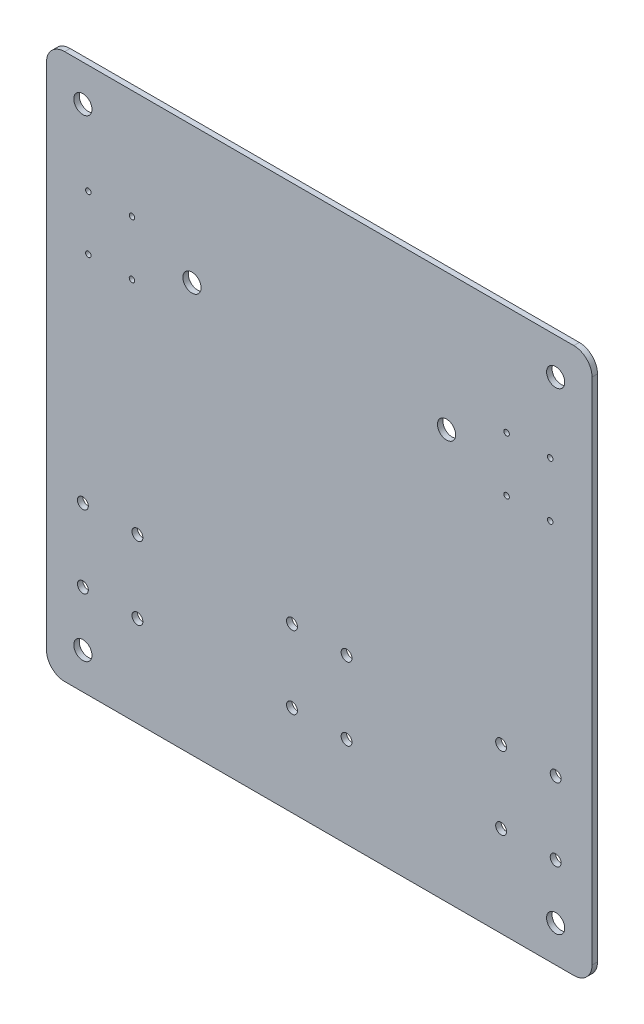
ISO-10303-21;
HEADER;
FILE_DESCRIPTION(('STEP AP214'),'2;1');
FILE_NAME('part.step','',(''),(''),'','','');
FILE_SCHEMA(('AUTOMOTIVE_DESIGN { 1 0 10303 214 1 1 1 1 }'));
ENDSEC;
DATA;
#1=APPLICATION_CONTEXT('core data for automotive mechanical design processes');
#2=APPLICATION_PROTOCOL_DEFINITION('international standard','automotive_design',2000,#1);
#3=PRODUCT_CONTEXT('',#1,'mechanical');
#4=PRODUCT('Part','Part','',(#3));
#5=PRODUCT_RELATED_PRODUCT_CATEGORY('part','',(#4));
#6=PRODUCT_DEFINITION_FORMATION('','',#4);
#7=PRODUCT_DEFINITION_CONTEXT('part definition',#1,'design');
#8=PRODUCT_DEFINITION('design','',#6,#7);
#9=PRODUCT_DEFINITION_SHAPE('','',#8);
#10=(LENGTH_UNIT() NAMED_UNIT(*) SI_UNIT(.MILLI.,.METRE.));
#11=(NAMED_UNIT(*) PLANE_ANGLE_UNIT() SI_UNIT($,.RADIAN.));
#12=(NAMED_UNIT(*) SI_UNIT($,.STERADIAN.) SOLID_ANGLE_UNIT());
#13=UNCERTAINTY_MEASURE_WITH_UNIT(LENGTH_MEASURE(1.E-05),#10,'distance_accuracy_value','');
#14=(GEOMETRIC_REPRESENTATION_CONTEXT(3) GLOBAL_UNCERTAINTY_ASSIGNED_CONTEXT((#13)) GLOBAL_UNIT_ASSIGNED_CONTEXT((#10,
#11,#12)) REPRESENTATION_CONTEXT('',''));
#15=CARTESIAN_POINT('',(0.,0.,0.));
#16=DIRECTION('',(0.,0.,1.));
#17=DIRECTION('',(1.,0.,0.));
#18=AXIS2_PLACEMENT_3D('',#15,#16,#17);
#19=CARTESIAN_POINT('',(-150.,150.,3.));
#20=DIRECTION('',(1.,0.,0.));
#21=DIRECTION('',(0.,0.,-1.));
#22=AXIS2_PLACEMENT_3D('',#19,#20,#21);
#23=PLANE('',#22);
#24=DIRECTION('',(0.,-1.,0.));
#25=VECTOR('',#24,1.);
#26=CARTESIAN_POINT('',(-150.,150.,0.));
#27=LINE('',#26,#25);
#28=CARTESIAN_POINT('',(-150.,140.,0.));
#29=VERTEX_POINT('',#28);
#30=CARTESIAN_POINT('',(-150.,-140.,0.));
#31=VERTEX_POINT('',#30);
#32=EDGE_CURVE('E128',#29,#31,#27,.T.);
#33=ORIENTED_EDGE('',*,*,#32,.T.);
#34=DIRECTION('',(0.,0.,-1.));
#35=VECTOR('',#34,1.);
#36=CARTESIAN_POINT('',(-150.,-140.,3.));
#37=LINE('',#36,#35);
#38=CARTESIAN_POINT('',(-150.,-140.,3.));
#39=VERTEX_POINT('',#38);
#40=EDGE_CURVE('E106',#31,#39,#37,.F.);
#41=ORIENTED_EDGE('',*,*,#40,.T.);
#42=DIRECTION('',(0.,-1.,0.));
#43=VECTOR('',#42,1.);
#44=CARTESIAN_POINT('',(-150.,150.,3.));
#45=LINE('',#44,#43);
#46=CARTESIAN_POINT('',(-150.,140.,3.));
#47=VERTEX_POINT('',#46);
#48=EDGE_CURVE('E138',#47,#39,#45,.T.);
#49=ORIENTED_EDGE('',*,*,#48,.F.);
#50=DIRECTION('',(0.,0.,-1.));
#51=VECTOR('',#50,1.);
#52=CARTESIAN_POINT('',(-150.,140.,3.));
#53=LINE('',#52,#51);
#54=EDGE_CURVE('E111',#47,#29,#53,.T.);
#55=ORIENTED_EDGE('',*,*,#54,.T.);
#56=EDGE_LOOP('',(#33,#41,#49,#55));
#57=FACE_BOUND('',#56,.T.);
#58=ADVANCED_FACE('F35',(#57),#23,.F.);
#59=CARTESIAN_POINT('',(-150.,-150.,3.));
#60=DIRECTION('',(0.,1.,0.));
#61=DIRECTION('',(-1.,0.,0.));
#62=AXIS2_PLACEMENT_3D('',#59,#60,#61);
#63=PLANE('',#62);
#64=DIRECTION('',(1.,0.,0.));
#65=VECTOR('',#64,1.);
#66=CARTESIAN_POINT('',(-150.,-150.,3.));
#67=LINE('',#66,#65);
#68=CARTESIAN_POINT('',(-140.,-150.,3.));
#69=VERTEX_POINT('',#68);
#70=CARTESIAN_POINT('',(140.,-150.,3.));
#71=VERTEX_POINT('',#70);
#72=EDGE_CURVE('E121',#69,#71,#67,.T.);
#73=ORIENTED_EDGE('',*,*,#72,.F.);
#74=DIRECTION('',(0.,0.,-1.));
#75=VECTOR('',#74,1.);
#76=CARTESIAN_POINT('',(-140.,-150.,3.));
#77=LINE('',#76,#75);
#78=CARTESIAN_POINT('',(-140.,-150.,0.));
#79=VERTEX_POINT('',#78);
#80=EDGE_CURVE('E105',#69,#79,#77,.T.);
#81=ORIENTED_EDGE('',*,*,#80,.T.);
#82=DIRECTION('',(1.,0.,0.));
#83=VECTOR('',#82,1.);
#84=CARTESIAN_POINT('',(-150.,-150.,0.));
#85=LINE('',#84,#83);
#86=CARTESIAN_POINT('',(140.,-150.,0.));
#87=VERTEX_POINT('',#86);
#88=EDGE_CURVE('E118',#79,#87,#85,.T.);
#89=ORIENTED_EDGE('',*,*,#88,.T.);
#90=DIRECTION('',(0.,0.,-1.));
#91=VECTOR('',#90,1.);
#92=CARTESIAN_POINT('',(140.,-150.,3.));
#93=LINE('',#92,#91);
#94=EDGE_CURVE('E123',#87,#71,#93,.F.);
#95=ORIENTED_EDGE('',*,*,#94,.T.);
#96=EDGE_LOOP('',(#73,#81,#89,#95));
#97=FACE_BOUND('',#96,.T.);
#98=ADVANCED_FACE('F117',(#97),#63,.F.);
#99=CARTESIAN_POINT('',(150.,150.,3.));
#100=DIRECTION('',(-1.,0.,0.));
#101=DIRECTION('',(0.,-1.,0.));
#102=AXIS2_PLACEMENT_3D('',#99,#100,#101);
#103=PLANE('',#102);
#104=DIRECTION('',(0.,1.,0.));
#105=VECTOR('',#104,1.);
#106=CARTESIAN_POINT('',(150.,150.,3.));
#107=LINE('',#106,#105);
#108=CARTESIAN_POINT('',(150.,-140.,3.));
#109=VERTEX_POINT('',#108);
#110=CARTESIAN_POINT('',(150.,140.,3.));
#111=VERTEX_POINT('',#110);
#112=EDGE_CURVE('E164',#109,#111,#107,.T.);
#113=ORIENTED_EDGE('',*,*,#112,.F.);
#114=DIRECTION('',(0.,0.,-1.));
#115=VECTOR('',#114,1.);
#116=CARTESIAN_POINT('',(150.,-140.,3.));
#117=LINE('',#116,#115);
#118=CARTESIAN_POINT('',(150.,-140.,0.));
#119=VERTEX_POINT('',#118);
#120=EDGE_CURVE('E157',#109,#119,#117,.T.);
#121=ORIENTED_EDGE('',*,*,#120,.T.);
#122=DIRECTION('',(0.,1.,0.));
#123=VECTOR('',#122,1.);
#124=CARTESIAN_POINT('',(150.,150.,0.));
#125=LINE('',#124,#123);
#126=CARTESIAN_POINT('',(150.,140.,0.));
#127=VERTEX_POINT('',#126);
#128=EDGE_CURVE('E127',#119,#127,#125,.T.);
#129=ORIENTED_EDGE('',*,*,#128,.T.);
#130=DIRECTION('',(0.,0.,-1.));
#131=VECTOR('',#130,1.);
#132=CARTESIAN_POINT('',(150.,140.,3.));
#133=LINE('',#132,#131);
#134=EDGE_CURVE('E155',#127,#111,#133,.F.);
#135=ORIENTED_EDGE('',*,*,#134,.T.);
#136=EDGE_LOOP('',(#113,#121,#129,#135));
#137=FACE_BOUND('',#136,.T.);
#138=ADVANCED_FACE('F162',(#137),#103,.F.);
#139=CARTESIAN_POINT('',(-150.,150.,3.));
#140=DIRECTION('',(0.,-1.,0.));
#141=DIRECTION('',(0.,0.,-1.));
#142=AXIS2_PLACEMENT_3D('',#139,#140,#141);
#143=PLANE('',#142);
#144=DIRECTION('',(-1.,0.,0.));
#145=VECTOR('',#144,1.);
#146=CARTESIAN_POINT('',(-150.,150.,3.));
#147=LINE('',#146,#145);
#148=CARTESIAN_POINT('',(140.,150.,3.));
#149=VERTEX_POINT('',#148);
#150=CARTESIAN_POINT('',(-140.,150.,3.));
#151=VERTEX_POINT('',#150);
#152=EDGE_CURVE('E139',#149,#151,#147,.T.);
#153=ORIENTED_EDGE('',*,*,#152,.F.);
#154=DIRECTION('',(0.,0.,-1.));
#155=VECTOR('',#154,1.);
#156=CARTESIAN_POINT('',(140.,150.,3.));
#157=LINE('',#156,#155);
#158=CARTESIAN_POINT('',(140.,150.,0.));
#159=VERTEX_POINT('',#158);
#160=EDGE_CURVE('E11',#149,#159,#157,.T.);
#161=ORIENTED_EDGE('',*,*,#160,.T.);
#162=DIRECTION('',(-1.,0.,0.));
#163=VECTOR('',#162,1.);
#164=CARTESIAN_POINT('',(-150.,150.,0.));
#165=LINE('',#164,#163);
#166=CARTESIAN_POINT('',(-140.,150.,0.));
#167=VERTEX_POINT('',#166);
#168=EDGE_CURVE('E131',#159,#167,#165,.T.);
#169=ORIENTED_EDGE('',*,*,#168,.T.);
#170=DIRECTION('',(0.,0.,-1.));
#171=VECTOR('',#170,1.);
#172=CARTESIAN_POINT('',(-140.,150.,3.));
#173=LINE('',#172,#171);
#174=EDGE_CURVE('E43',#167,#151,#173,.F.);
#175=ORIENTED_EDGE('',*,*,#174,.T.);
#176=EDGE_LOOP('',(#153,#161,#169,#175));
#177=FACE_BOUND('',#176,.T.);
#178=ADVANCED_FACE('F171',(#177),#143,.F.);
#179=CARTESIAN_POINT('',(0.,0.,3.));
#180=DIRECTION('',(0.,0.,1.));
#181=DIRECTION('',(1.,0.,0.));
#182=AXIS2_PLACEMENT_3D('',#179,#180,#181);
#183=PLANE('',#182);
#184=CARTESIAN_POINT('',(15.,-100.,3.));
#185=DIRECTION('',(0.,0.,1.));
#186=DIRECTION('',(1.,0.,0.));
#187=AXIS2_PLACEMENT_3D('',#184,#185,#186);
#188=CIRCLE('',#187,3.);
#189=CARTESIAN_POINT('',(18.,-100.,3.));
#190=VERTEX_POINT('',#189);
#191=EDGE_CURVE('E328',#190,#190,#188,.T.);
#192=ORIENTED_EDGE('',*,*,#191,.F.);
#193=EDGE_LOOP('',(#192));
#194=FACE_BOUND('',#193,.T.);
#195=CARTESIAN_POINT('',(-15.,-100.,3.));
#196=DIRECTION('',(0.,0.,1.));
#197=DIRECTION('',(1.,0.,0.));
#198=AXIS2_PLACEMENT_3D('',#195,#196,#197);
#199=CIRCLE('',#198,3.);
#200=CARTESIAN_POINT('',(-12.,-100.,3.));
#201=VERTEX_POINT('',#200);
#202=EDGE_CURVE('E322',#201,#201,#199,.T.);
#203=ORIENTED_EDGE('',*,*,#202,.F.);
#204=EDGE_LOOP('',(#203));
#205=FACE_BOUND('',#204,.T.);
#206=CARTESIAN_POINT('',(15.,-60.,3.));
#207=DIRECTION('',(0.,0.,1.));
#208=DIRECTION('',(1.,0.,0.));
#209=AXIS2_PLACEMENT_3D('',#206,#207,#208);
#210=CIRCLE('',#209,3.);
#211=CARTESIAN_POINT('',(18.,-60.,3.));
#212=VERTEX_POINT('',#211);
#213=EDGE_CURVE('E316',#212,#212,#210,.T.);
#214=ORIENTED_EDGE('',*,*,#213,.F.);
#215=EDGE_LOOP('',(#214));
#216=FACE_BOUND('',#215,.T.);
#217=CARTESIAN_POINT('',(-15.,-60.,3.));
#218=DIRECTION('',(0.,0.,1.));
#219=DIRECTION('',(1.,0.,0.));
#220=AXIS2_PLACEMENT_3D('',#217,#218,#219);
#221=CIRCLE('',#220,3.);
#222=CARTESIAN_POINT('',(-12.,-60.,3.));
#223=VERTEX_POINT('',#222);
#224=EDGE_CURVE('E310',#223,#223,#221,.T.);
#225=ORIENTED_EDGE('',*,*,#224,.F.);
#226=EDGE_LOOP('',(#225));
#227=FACE_BOUND('',#226,.T.);
#228=CARTESIAN_POINT('',(100.,-100.,3.));
#229=DIRECTION('',(0.,0.,-1.));
#230=DIRECTION('',(-1.,0.,0.));
#231=AXIS2_PLACEMENT_3D('',#228,#229,#230);
#232=CIRCLE('',#231,3.00000000000001);
#233=CARTESIAN_POINT('',(97.,-100.,3.));
#234=VERTEX_POINT('',#233);
#235=EDGE_CURVE('E304',#234,#234,#232,.T.);
#236=ORIENTED_EDGE('',*,*,#235,.T.);
#237=EDGE_LOOP('',(#236));
#238=FACE_BOUND('',#237,.T.);
#239=CARTESIAN_POINT('',(100.,-60.,3.));
#240=DIRECTION('',(0.,0.,-1.));
#241=DIRECTION('',(-1.,0.,0.));
#242=AXIS2_PLACEMENT_3D('',#239,#240,#241);
#243=CIRCLE('',#242,3.00000000000001);
#244=CARTESIAN_POINT('',(97.,-60.,3.));
#245=VERTEX_POINT('',#244);
#246=EDGE_CURVE('E298',#245,#245,#243,.T.);
#247=ORIENTED_EDGE('',*,*,#246,.T.);
#248=EDGE_LOOP('',(#247));
#249=FACE_BOUND('',#248,.T.);
#250=CARTESIAN_POINT('',(130.,-60.,3.));
#251=DIRECTION('',(0.,0.,-1.));
#252=DIRECTION('',(-1.,0.,0.));
#253=AXIS2_PLACEMENT_3D('',#250,#251,#252);
#254=CIRCLE('',#253,2.99999999999999);
#255=CARTESIAN_POINT('',(127.,-60.,3.));
#256=VERTEX_POINT('',#255);
#257=EDGE_CURVE('E292',#256,#256,#254,.T.);
#258=ORIENTED_EDGE('',*,*,#257,.T.);
#259=EDGE_LOOP('',(#258));
#260=FACE_BOUND('',#259,.T.);
#261=CARTESIAN_POINT('',(130.,-100.,3.));
#262=DIRECTION('',(0.,0.,-1.));
#263=DIRECTION('',(-1.,0.,0.));
#264=AXIS2_PLACEMENT_3D('',#261,#262,#263);
#265=CIRCLE('',#264,2.99999999999999);
#266=CARTESIAN_POINT('',(127.,-100.,3.));
#267=VERTEX_POINT('',#266);
#268=EDGE_CURVE('E286',#267,#267,#265,.T.);
#269=ORIENTED_EDGE('',*,*,#268,.T.);
#270=EDGE_LOOP('',(#269));
#271=FACE_BOUND('',#270,.T.);
#272=CARTESIAN_POINT('',(-100.,-100.,3.));
#273=DIRECTION('',(0.,0.,1.));
#274=DIRECTION('',(1.,0.,0.));
#275=AXIS2_PLACEMENT_3D('',#272,#273,#274);
#276=CIRCLE('',#275,3.00000000000001);
#277=CARTESIAN_POINT('',(-97.,-100.,3.));
#278=VERTEX_POINT('',#277);
#279=EDGE_CURVE('E280',#278,#278,#276,.T.);
#280=ORIENTED_EDGE('',*,*,#279,.F.);
#281=EDGE_LOOP('',(#280));
#282=FACE_BOUND('',#281,.T.);
#283=CARTESIAN_POINT('',(-100.,-60.,3.));
#284=DIRECTION('',(0.,0.,1.));
#285=DIRECTION('',(1.,0.,0.));
#286=AXIS2_PLACEMENT_3D('',#283,#284,#285);
#287=CIRCLE('',#286,3.00000000000001);
#288=CARTESIAN_POINT('',(-97.,-60.,3.));
#289=VERTEX_POINT('',#288);
#290=EDGE_CURVE('E274',#289,#289,#287,.T.);
#291=ORIENTED_EDGE('',*,*,#290,.F.);
#292=EDGE_LOOP('',(#291));
#293=FACE_BOUND('',#292,.T.);
#294=CARTESIAN_POINT('',(-130.,-60.,3.));
#295=DIRECTION('',(0.,0.,1.));
#296=DIRECTION('',(1.,0.,0.));
#297=AXIS2_PLACEMENT_3D('',#294,#295,#296);
#298=CIRCLE('',#297,2.99999999999999);
#299=CARTESIAN_POINT('',(-127.,-60.,3.));
#300=VERTEX_POINT('',#299);
#301=EDGE_CURVE('E268',#300,#300,#298,.T.);
#302=ORIENTED_EDGE('',*,*,#301,.F.);
#303=EDGE_LOOP('',(#302));
#304=FACE_BOUND('',#303,.T.);
#305=CARTESIAN_POINT('',(-130.,-100.,3.));
#306=DIRECTION('',(0.,0.,1.));
#307=DIRECTION('',(1.,0.,0.));
#308=AXIS2_PLACEMENT_3D('',#305,#306,#307);
#309=CIRCLE('',#308,2.99999999999999);
#310=CARTESIAN_POINT('',(-127.,-100.,3.));
#311=VERTEX_POINT('',#310);
#312=EDGE_CURVE('E262',#311,#311,#309,.T.);
#313=ORIENTED_EDGE('',*,*,#312,.F.);
#314=EDGE_LOOP('',(#313));
#315=FACE_BOUND('',#314,.T.);
#316=CARTESIAN_POINT('',(70.,75.,3.));
#317=DIRECTION('',(0.,0.,1.));
#318=DIRECTION('',(1.,0.,0.));
#319=AXIS2_PLACEMENT_3D('',#316,#317,#318);
#320=CIRCLE('',#319,5.00000000000001);
#321=CARTESIAN_POINT('',(75.0000000000001,75.,3.));
#322=VERTEX_POINT('',#321);
#323=EDGE_CURVE('E256',#322,#322,#320,.T.);
#324=ORIENTED_EDGE('',*,*,#323,.F.);
#325=EDGE_LOOP('',(#324));
#326=FACE_BOUND('',#325,.T.);
#327=CARTESIAN_POINT('',(-70.,75.,3.));
#328=DIRECTION('',(0.,0.,1.));
#329=DIRECTION('',(1.,0.,0.));
#330=AXIS2_PLACEMENT_3D('',#327,#328,#329);
#331=CIRCLE('',#330,5.00000000000001);
#332=CARTESIAN_POINT('',(-65.,75.,3.));
#333=VERTEX_POINT('',#332);
#334=EDGE_CURVE('E250',#333,#333,#331,.T.);
#335=ORIENTED_EDGE('',*,*,#334,.F.);
#336=EDGE_LOOP('',(#335));
#337=FACE_BOUND('',#336,.T.);
#338=CARTESIAN_POINT('',(130.,-130.,3.));
#339=DIRECTION('',(0.,0.,1.));
#340=DIRECTION('',(-1.,0.,0.));
#341=AXIS2_PLACEMENT_3D('',#338,#339,#340);
#342=CIRCLE('',#341,5.00000000000002);
#343=CARTESIAN_POINT('',(125.,-130.,3.));
#344=VERTEX_POINT('',#343);
#345=EDGE_CURVE('E244',#344,#344,#342,.T.);
#346=ORIENTED_EDGE('',*,*,#345,.F.);
#347=EDGE_LOOP('',(#346));
#348=FACE_BOUND('',#347,.T.);
#349=CARTESIAN_POINT('',(-130.,-130.,3.));
#350=DIRECTION('',(0.,0.,-1.));
#351=DIRECTION('',(1.,0.,0.));
#352=AXIS2_PLACEMENT_3D('',#349,#350,#351);
#353=CIRCLE('',#352,5.00000000000002);
#354=CARTESIAN_POINT('',(-125.,-130.,3.));
#355=VERTEX_POINT('',#354);
#356=EDGE_CURVE('E238',#355,#355,#353,.T.);
#357=ORIENTED_EDGE('',*,*,#356,.T.);
#358=EDGE_LOOP('',(#357));
#359=FACE_BOUND('',#358,.T.);
#360=CARTESIAN_POINT('',(130.,130.,3.));
#361=DIRECTION('',(0.,0.,-1.));
#362=DIRECTION('',(-1.,0.,0.));
#363=AXIS2_PLACEMENT_3D('',#360,#361,#362);
#364=CIRCLE('',#363,5.00000000000002);
#365=CARTESIAN_POINT('',(125.,130.,3.));
#366=VERTEX_POINT('',#365);
#367=EDGE_CURVE('E232',#366,#366,#364,.T.);
#368=ORIENTED_EDGE('',*,*,#367,.T.);
#369=EDGE_LOOP('',(#368));
#370=FACE_BOUND('',#369,.T.);
#371=CARTESIAN_POINT('',(-130.,130.,3.));
#372=DIRECTION('',(0.,0.,1.));
#373=DIRECTION('',(1.,0.,0.));
#374=AXIS2_PLACEMENT_3D('',#371,#372,#373);
#375=CIRCLE('',#374,5.00000000000002);
#376=CARTESIAN_POINT('',(-125.,130.,3.));
#377=VERTEX_POINT('',#376);
#378=EDGE_CURVE('E226',#377,#377,#375,.T.);
#379=ORIENTED_EDGE('',*,*,#378,.F.);
#380=EDGE_LOOP('',(#379));
#381=FACE_BOUND('',#380,.T.);
#382=CARTESIAN_POINT('',(-127.,60.,3.));
#383=DIRECTION('',(0.,0.,-1.));
#384=DIRECTION('',(-1.,0.,0.));
#385=AXIS2_PLACEMENT_3D('',#382,#383,#384);
#386=CIRCLE('',#385,1.5);
#387=CARTESIAN_POINT('',(-128.5,60.,3.));
#388=VERTEX_POINT('',#387);
#389=EDGE_CURVE('E220',#388,#388,#386,.T.);
#390=ORIENTED_EDGE('',*,*,#389,.T.);
#391=EDGE_LOOP('',(#390));
#392=FACE_BOUND('',#391,.T.);
#393=CARTESIAN_POINT('',(-103.,60.,3.));
#394=DIRECTION('',(0.,0.,-1.));
#395=DIRECTION('',(-1.,0.,0.));
#396=AXIS2_PLACEMENT_3D('',#393,#394,#395);
#397=CIRCLE('',#396,1.5);
#398=CARTESIAN_POINT('',(-104.5,60.,3.));
#399=VERTEX_POINT('',#398);
#400=EDGE_CURVE('E214',#399,#399,#397,.T.);
#401=ORIENTED_EDGE('',*,*,#400,.T.);
#402=EDGE_LOOP('',(#401));
#403=FACE_BOUND('',#402,.T.);
#404=CARTESIAN_POINT('',(-127.,90.,3.));
#405=DIRECTION('',(0.,0.,-1.));
#406=DIRECTION('',(-1.,0.,0.));
#407=AXIS2_PLACEMENT_3D('',#404,#405,#406);
#408=CIRCLE('',#407,1.5);
#409=CARTESIAN_POINT('',(-128.5,90.,3.));
#410=VERTEX_POINT('',#409);
#411=EDGE_CURVE('E208',#410,#410,#408,.T.);
#412=ORIENTED_EDGE('',*,*,#411,.T.);
#413=EDGE_LOOP('',(#412));
#414=FACE_BOUND('',#413,.T.);
#415=CARTESIAN_POINT('',(-103.,90.,3.));
#416=DIRECTION('',(0.,0.,-1.));
#417=DIRECTION('',(-1.,0.,0.));
#418=AXIS2_PLACEMENT_3D('',#415,#416,#417);
#419=CIRCLE('',#418,1.5);
#420=CARTESIAN_POINT('',(-104.5,90.,3.));
#421=VERTEX_POINT('',#420);
#422=EDGE_CURVE('E202',#421,#421,#419,.T.);
#423=ORIENTED_EDGE('',*,*,#422,.T.);
#424=EDGE_LOOP('',(#423));
#425=FACE_BOUND('',#424,.T.);
#426=CARTESIAN_POINT('',(127.,60.,3.));
#427=DIRECTION('',(0.,0.,1.));
#428=DIRECTION('',(1.,0.,0.));
#429=AXIS2_PLACEMENT_3D('',#426,#427,#428);
#430=CIRCLE('',#429,1.5);
#431=CARTESIAN_POINT('',(128.5,60.,3.));
#432=VERTEX_POINT('',#431);
#433=EDGE_CURVE('E196',#432,#432,#430,.T.);
#434=ORIENTED_EDGE('',*,*,#433,.F.);
#435=EDGE_LOOP('',(#434));
#436=FACE_BOUND('',#435,.T.);
#437=CARTESIAN_POINT('',(103.,60.,3.));
#438=DIRECTION('',(0.,0.,1.));
#439=DIRECTION('',(1.,0.,0.));
#440=AXIS2_PLACEMENT_3D('',#437,#438,#439);
#441=CIRCLE('',#440,1.5);
#442=CARTESIAN_POINT('',(104.5,60.,3.));
#443=VERTEX_POINT('',#442);
#444=EDGE_CURVE('E190',#443,#443,#441,.T.);
#445=ORIENTED_EDGE('',*,*,#444,.F.);
#446=EDGE_LOOP('',(#445));
#447=FACE_BOUND('',#446,.T.);
#448=CARTESIAN_POINT('',(127.,90.,3.));
#449=DIRECTION('',(0.,0.,1.));
#450=DIRECTION('',(1.,0.,0.));
#451=AXIS2_PLACEMENT_3D('',#448,#449,#450);
#452=CIRCLE('',#451,1.5);
#453=CARTESIAN_POINT('',(128.5,90.,3.));
#454=VERTEX_POINT('',#453);
#455=EDGE_CURVE('E184',#454,#454,#452,.T.);
#456=ORIENTED_EDGE('',*,*,#455,.F.);
#457=EDGE_LOOP('',(#456));
#458=FACE_BOUND('',#457,.T.);
#459=CARTESIAN_POINT('',(103.,90.,3.));
#460=DIRECTION('',(0.,0.,1.));
#461=DIRECTION('',(1.,0.,0.));
#462=AXIS2_PLACEMENT_3D('',#459,#460,#461);
#463=CIRCLE('',#462,1.5);
#464=CARTESIAN_POINT('',(104.5,90.,3.));
#465=VERTEX_POINT('',#464);
#466=EDGE_CURVE('E178',#465,#465,#463,.T.);
#467=ORIENTED_EDGE('',*,*,#466,.F.);
#468=EDGE_LOOP('',(#467));
#469=FACE_BOUND('',#468,.T.);
#470=ORIENTED_EDGE('',*,*,#48,.T.);
#471=CARTESIAN_POINT('',(-140.,-140.,3.));
#472=DIRECTION('',(0.,0.,1.));
#473=DIRECTION('',(1.,0.,0.));
#474=AXIS2_PLACEMENT_3D('',#471,#472,#473);
#475=CIRCLE('',#474,10.);
#476=EDGE_CURVE('E153',#39,#69,#475,.T.);
#477=ORIENTED_EDGE('',*,*,#476,.T.);
#478=ORIENTED_EDGE('',*,*,#72,.T.);
#479=CARTESIAN_POINT('',(140.,-140.,3.));
#480=DIRECTION('',(0.,0.,1.));
#481=DIRECTION('',(1.,0.,0.));
#482=AXIS2_PLACEMENT_3D('',#479,#480,#481);
#483=CIRCLE('',#482,10.);
#484=EDGE_CURVE('E151',#71,#109,#483,.T.);
#485=ORIENTED_EDGE('',*,*,#484,.T.);
#486=ORIENTED_EDGE('',*,*,#112,.T.);
#487=CARTESIAN_POINT('',(140.,140.,3.));
#488=DIRECTION('',(0.,0.,1.));
#489=DIRECTION('',(1.,0.,0.));
#490=AXIS2_PLACEMENT_3D('',#487,#488,#489);
#491=CIRCLE('',#490,10.);
#492=EDGE_CURVE('E56',#111,#149,#491,.T.);
#493=ORIENTED_EDGE('',*,*,#492,.T.);
#494=ORIENTED_EDGE('',*,*,#152,.T.);
#495=CARTESIAN_POINT('',(-140.,140.,3.));
#496=DIRECTION('',(0.,0.,1.));
#497=DIRECTION('',(1.,0.,0.));
#498=AXIS2_PLACEMENT_3D('',#495,#496,#497);
#499=CIRCLE('',#498,10.);
#500=EDGE_CURVE('E148',#151,#47,#499,.T.);
#501=ORIENTED_EDGE('',*,*,#500,.T.);
#502=EDGE_LOOP('',(#470,#477,#478,#485,#486,#493,#494,#501));
#503=FACE_BOUND('',#502,.T.);
#504=ADVANCED_FACE('F343',(#194,#205,#216,#227,#238,#249,#260,#271,#282,#293,#304,#315,#326,
#337,#348,#359,#370,#381,#392,#403,#414,#425,#436,#447,#458,#469,#503),#183,.T.);
#505=CARTESIAN_POINT('',(0.,0.,0.));
#506=DIRECTION('',(0.,0.,1.));
#507=DIRECTION('',(1.,0.,0.));
#508=AXIS2_PLACEMENT_3D('',#505,#506,#507);
#509=PLANE('',#508);
#510=CARTESIAN_POINT('',(15.,-100.,0.));
#511=DIRECTION('',(0.,0.,1.));
#512=DIRECTION('',(1.,0.,0.));
#513=AXIS2_PLACEMENT_3D('',#510,#511,#512);
#514=CIRCLE('',#513,3.);
#515=CARTESIAN_POINT('',(18.,-100.,0.));
#516=VERTEX_POINT('',#515);
#517=EDGE_CURVE('E325',#516,#516,#514,.T.);
#518=ORIENTED_EDGE('',*,*,#517,.T.);
#519=EDGE_LOOP('',(#518));
#520=FACE_BOUND('',#519,.T.);
#521=CARTESIAN_POINT('',(-15.,-100.,0.));
#522=DIRECTION('',(0.,0.,1.));
#523=DIRECTION('',(1.,0.,0.));
#524=AXIS2_PLACEMENT_3D('',#521,#522,#523);
#525=CIRCLE('',#524,3.);
#526=CARTESIAN_POINT('',(-12.,-100.,0.));
#527=VERTEX_POINT('',#526);
#528=EDGE_CURVE('E319',#527,#527,#525,.T.);
#529=ORIENTED_EDGE('',*,*,#528,.T.);
#530=EDGE_LOOP('',(#529));
#531=FACE_BOUND('',#530,.T.);
#532=CARTESIAN_POINT('',(15.,-60.,0.));
#533=DIRECTION('',(0.,0.,1.));
#534=DIRECTION('',(1.,0.,0.));
#535=AXIS2_PLACEMENT_3D('',#532,#533,#534);
#536=CIRCLE('',#535,3.);
#537=CARTESIAN_POINT('',(18.,-60.,0.));
#538=VERTEX_POINT('',#537);
#539=EDGE_CURVE('E313',#538,#538,#536,.T.);
#540=ORIENTED_EDGE('',*,*,#539,.T.);
#541=EDGE_LOOP('',(#540));
#542=FACE_BOUND('',#541,.T.);
#543=CARTESIAN_POINT('',(-15.,-60.,0.));
#544=DIRECTION('',(0.,0.,1.));
#545=DIRECTION('',(1.,0.,0.));
#546=AXIS2_PLACEMENT_3D('',#543,#544,#545);
#547=CIRCLE('',#546,3.);
#548=CARTESIAN_POINT('',(-12.,-60.,0.));
#549=VERTEX_POINT('',#548);
#550=EDGE_CURVE('E307',#549,#549,#547,.T.);
#551=ORIENTED_EDGE('',*,*,#550,.T.);
#552=EDGE_LOOP('',(#551));
#553=FACE_BOUND('',#552,.T.);
#554=CARTESIAN_POINT('',(100.,-100.,0.));
#555=DIRECTION('',(0.,0.,-1.));
#556=DIRECTION('',(-1.,0.,0.));
#557=AXIS2_PLACEMENT_3D('',#554,#555,#556);
#558=CIRCLE('',#557,3.00000000000001);
#559=CARTESIAN_POINT('',(97.,-100.,0.));
#560=VERTEX_POINT('',#559);
#561=EDGE_CURVE('E301',#560,#560,#558,.T.);
#562=ORIENTED_EDGE('',*,*,#561,.F.);
#563=EDGE_LOOP('',(#562));
#564=FACE_BOUND('',#563,.T.);
#565=CARTESIAN_POINT('',(100.,-60.,0.));
#566=DIRECTION('',(0.,0.,-1.));
#567=DIRECTION('',(-1.,0.,0.));
#568=AXIS2_PLACEMENT_3D('',#565,#566,#567);
#569=CIRCLE('',#568,3.00000000000001);
#570=CARTESIAN_POINT('',(97.,-60.,0.));
#571=VERTEX_POINT('',#570);
#572=EDGE_CURVE('E295',#571,#571,#569,.T.);
#573=ORIENTED_EDGE('',*,*,#572,.F.);
#574=EDGE_LOOP('',(#573));
#575=FACE_BOUND('',#574,.T.);
#576=CARTESIAN_POINT('',(130.,-60.,0.));
#577=DIRECTION('',(0.,0.,-1.));
#578=DIRECTION('',(-1.,0.,0.));
#579=AXIS2_PLACEMENT_3D('',#576,#577,#578);
#580=CIRCLE('',#579,2.99999999999999);
#581=CARTESIAN_POINT('',(127.,-60.,0.));
#582=VERTEX_POINT('',#581);
#583=EDGE_CURVE('E289',#582,#582,#580,.T.);
#584=ORIENTED_EDGE('',*,*,#583,.F.);
#585=EDGE_LOOP('',(#584));
#586=FACE_BOUND('',#585,.T.);
#587=CARTESIAN_POINT('',(130.,-100.,0.));
#588=DIRECTION('',(0.,0.,-1.));
#589=DIRECTION('',(-1.,0.,0.));
#590=AXIS2_PLACEMENT_3D('',#587,#588,#589);
#591=CIRCLE('',#590,2.99999999999999);
#592=CARTESIAN_POINT('',(127.,-100.,0.));
#593=VERTEX_POINT('',#592);
#594=EDGE_CURVE('E283',#593,#593,#591,.T.);
#595=ORIENTED_EDGE('',*,*,#594,.F.);
#596=EDGE_LOOP('',(#595));
#597=FACE_BOUND('',#596,.T.);
#598=CARTESIAN_POINT('',(-100.,-100.,0.));
#599=DIRECTION('',(0.,0.,1.));
#600=DIRECTION('',(1.,0.,0.));
#601=AXIS2_PLACEMENT_3D('',#598,#599,#600);
#602=CIRCLE('',#601,3.00000000000001);
#603=CARTESIAN_POINT('',(-97.,-100.,0.));
#604=VERTEX_POINT('',#603);
#605=EDGE_CURVE('E277',#604,#604,#602,.T.);
#606=ORIENTED_EDGE('',*,*,#605,.T.);
#607=EDGE_LOOP('',(#606));
#608=FACE_BOUND('',#607,.T.);
#609=CARTESIAN_POINT('',(-100.,-60.,0.));
#610=DIRECTION('',(0.,0.,1.));
#611=DIRECTION('',(1.,0.,0.));
#612=AXIS2_PLACEMENT_3D('',#609,#610,#611);
#613=CIRCLE('',#612,3.00000000000001);
#614=CARTESIAN_POINT('',(-97.,-60.,0.));
#615=VERTEX_POINT('',#614);
#616=EDGE_CURVE('E271',#615,#615,#613,.T.);
#617=ORIENTED_EDGE('',*,*,#616,.T.);
#618=EDGE_LOOP('',(#617));
#619=FACE_BOUND('',#618,.T.);
#620=CARTESIAN_POINT('',(-130.,-60.,0.));
#621=DIRECTION('',(0.,0.,1.));
#622=DIRECTION('',(1.,0.,0.));
#623=AXIS2_PLACEMENT_3D('',#620,#621,#622);
#624=CIRCLE('',#623,2.99999999999999);
#625=CARTESIAN_POINT('',(-127.,-60.,0.));
#626=VERTEX_POINT('',#625);
#627=EDGE_CURVE('E265',#626,#626,#624,.T.);
#628=ORIENTED_EDGE('',*,*,#627,.T.);
#629=EDGE_LOOP('',(#628));
#630=FACE_BOUND('',#629,.T.);
#631=CARTESIAN_POINT('',(-130.,-100.,0.));
#632=DIRECTION('',(0.,0.,1.));
#633=DIRECTION('',(1.,0.,0.));
#634=AXIS2_PLACEMENT_3D('',#631,#632,#633);
#635=CIRCLE('',#634,2.99999999999999);
#636=CARTESIAN_POINT('',(-127.,-100.,0.));
#637=VERTEX_POINT('',#636);
#638=EDGE_CURVE('E259',#637,#637,#635,.T.);
#639=ORIENTED_EDGE('',*,*,#638,.T.);
#640=EDGE_LOOP('',(#639));
#641=FACE_BOUND('',#640,.T.);
#642=CARTESIAN_POINT('',(70.,75.,0.));
#643=DIRECTION('',(0.,0.,1.));
#644=DIRECTION('',(1.,0.,0.));
#645=AXIS2_PLACEMENT_3D('',#642,#643,#644);
#646=CIRCLE('',#645,5.00000000000001);
#647=CARTESIAN_POINT('',(75.0000000000001,75.,0.));
#648=VERTEX_POINT('',#647);
#649=EDGE_CURVE('E253',#648,#648,#646,.T.);
#650=ORIENTED_EDGE('',*,*,#649,.T.);
#651=EDGE_LOOP('',(#650));
#652=FACE_BOUND('',#651,.T.);
#653=CARTESIAN_POINT('',(-70.,75.,0.));
#654=DIRECTION('',(0.,0.,1.));
#655=DIRECTION('',(1.,0.,0.));
#656=AXIS2_PLACEMENT_3D('',#653,#654,#655);
#657=CIRCLE('',#656,5.00000000000001);
#658=CARTESIAN_POINT('',(-65.,75.,0.));
#659=VERTEX_POINT('',#658);
#660=EDGE_CURVE('E247',#659,#659,#657,.T.);
#661=ORIENTED_EDGE('',*,*,#660,.T.);
#662=EDGE_LOOP('',(#661));
#663=FACE_BOUND('',#662,.T.);
#664=CARTESIAN_POINT('',(130.,-130.,0.));
#665=DIRECTION('',(0.,0.,1.));
#666=DIRECTION('',(-1.,0.,0.));
#667=AXIS2_PLACEMENT_3D('',#664,#665,#666);
#668=CIRCLE('',#667,5.00000000000002);
#669=CARTESIAN_POINT('',(125.,-130.,0.));
#670=VERTEX_POINT('',#669);
#671=EDGE_CURVE('E241',#670,#670,#668,.T.);
#672=ORIENTED_EDGE('',*,*,#671,.T.);
#673=EDGE_LOOP('',(#672));
#674=FACE_BOUND('',#673,.T.);
#675=CARTESIAN_POINT('',(-130.,-130.,0.));
#676=DIRECTION('',(0.,0.,-1.));
#677=DIRECTION('',(1.,0.,0.));
#678=AXIS2_PLACEMENT_3D('',#675,#676,#677);
#679=CIRCLE('',#678,5.00000000000002);
#680=CARTESIAN_POINT('',(-125.,-130.,0.));
#681=VERTEX_POINT('',#680);
#682=EDGE_CURVE('E235',#681,#681,#679,.T.);
#683=ORIENTED_EDGE('',*,*,#682,.F.);
#684=EDGE_LOOP('',(#683));
#685=FACE_BOUND('',#684,.T.);
#686=CARTESIAN_POINT('',(130.,130.,0.));
#687=DIRECTION('',(0.,0.,-1.));
#688=DIRECTION('',(-1.,0.,0.));
#689=AXIS2_PLACEMENT_3D('',#686,#687,#688);
#690=CIRCLE('',#689,5.00000000000002);
#691=CARTESIAN_POINT('',(125.,130.,0.));
#692=VERTEX_POINT('',#691);
#693=EDGE_CURVE('E229',#692,#692,#690,.T.);
#694=ORIENTED_EDGE('',*,*,#693,.F.);
#695=EDGE_LOOP('',(#694));
#696=FACE_BOUND('',#695,.T.);
#697=CARTESIAN_POINT('',(-130.,130.,0.));
#698=DIRECTION('',(0.,0.,1.));
#699=DIRECTION('',(1.,0.,0.));
#700=AXIS2_PLACEMENT_3D('',#697,#698,#699);
#701=CIRCLE('',#700,5.00000000000002);
#702=CARTESIAN_POINT('',(-125.,130.,0.));
#703=VERTEX_POINT('',#702);
#704=EDGE_CURVE('E223',#703,#703,#701,.T.);
#705=ORIENTED_EDGE('',*,*,#704,.T.);
#706=EDGE_LOOP('',(#705));
#707=FACE_BOUND('',#706,.T.);
#708=CARTESIAN_POINT('',(-127.,60.,0.));
#709=DIRECTION('',(0.,0.,-1.));
#710=DIRECTION('',(-1.,0.,0.));
#711=AXIS2_PLACEMENT_3D('',#708,#709,#710);
#712=CIRCLE('',#711,1.5);
#713=CARTESIAN_POINT('',(-128.5,60.,0.));
#714=VERTEX_POINT('',#713);
#715=EDGE_CURVE('E217',#714,#714,#712,.T.);
#716=ORIENTED_EDGE('',*,*,#715,.F.);
#717=EDGE_LOOP('',(#716));
#718=FACE_BOUND('',#717,.T.);
#719=CARTESIAN_POINT('',(-103.,60.,0.));
#720=DIRECTION('',(0.,0.,-1.));
#721=DIRECTION('',(-1.,0.,0.));
#722=AXIS2_PLACEMENT_3D('',#719,#720,#721);
#723=CIRCLE('',#722,1.5);
#724=CARTESIAN_POINT('',(-104.5,60.,0.));
#725=VERTEX_POINT('',#724);
#726=EDGE_CURVE('E211',#725,#725,#723,.T.);
#727=ORIENTED_EDGE('',*,*,#726,.F.);
#728=EDGE_LOOP('',(#727));
#729=FACE_BOUND('',#728,.T.);
#730=CARTESIAN_POINT('',(-127.,90.,0.));
#731=DIRECTION('',(0.,0.,-1.));
#732=DIRECTION('',(-1.,0.,0.));
#733=AXIS2_PLACEMENT_3D('',#730,#731,#732);
#734=CIRCLE('',#733,1.5);
#735=CARTESIAN_POINT('',(-128.5,90.,0.));
#736=VERTEX_POINT('',#735);
#737=EDGE_CURVE('E205',#736,#736,#734,.T.);
#738=ORIENTED_EDGE('',*,*,#737,.F.);
#739=EDGE_LOOP('',(#738));
#740=FACE_BOUND('',#739,.T.);
#741=CARTESIAN_POINT('',(-103.,90.,0.));
#742=DIRECTION('',(0.,0.,-1.));
#743=DIRECTION('',(-1.,0.,0.));
#744=AXIS2_PLACEMENT_3D('',#741,#742,#743);
#745=CIRCLE('',#744,1.5);
#746=CARTESIAN_POINT('',(-104.5,90.,0.));
#747=VERTEX_POINT('',#746);
#748=EDGE_CURVE('E199',#747,#747,#745,.T.);
#749=ORIENTED_EDGE('',*,*,#748,.F.);
#750=EDGE_LOOP('',(#749));
#751=FACE_BOUND('',#750,.T.);
#752=CARTESIAN_POINT('',(127.,60.,0.));
#753=DIRECTION('',(0.,0.,1.));
#754=DIRECTION('',(1.,0.,0.));
#755=AXIS2_PLACEMENT_3D('',#752,#753,#754);
#756=CIRCLE('',#755,1.5);
#757=CARTESIAN_POINT('',(128.5,60.,0.));
#758=VERTEX_POINT('',#757);
#759=EDGE_CURVE('E193',#758,#758,#756,.T.);
#760=ORIENTED_EDGE('',*,*,#759,.T.);
#761=EDGE_LOOP('',(#760));
#762=FACE_BOUND('',#761,.T.);
#763=CARTESIAN_POINT('',(103.,60.,0.));
#764=DIRECTION('',(0.,0.,1.));
#765=DIRECTION('',(1.,0.,0.));
#766=AXIS2_PLACEMENT_3D('',#763,#764,#765);
#767=CIRCLE('',#766,1.5);
#768=CARTESIAN_POINT('',(104.5,60.,0.));
#769=VERTEX_POINT('',#768);
#770=EDGE_CURVE('E187',#769,#769,#767,.T.);
#771=ORIENTED_EDGE('',*,*,#770,.T.);
#772=EDGE_LOOP('',(#771));
#773=FACE_BOUND('',#772,.T.);
#774=CARTESIAN_POINT('',(127.,90.,0.));
#775=DIRECTION('',(0.,0.,1.));
#776=DIRECTION('',(1.,0.,0.));
#777=AXIS2_PLACEMENT_3D('',#774,#775,#776);
#778=CIRCLE('',#777,1.5);
#779=CARTESIAN_POINT('',(128.5,90.,0.));
#780=VERTEX_POINT('',#779);
#781=EDGE_CURVE('E181',#780,#780,#778,.T.);
#782=ORIENTED_EDGE('',*,*,#781,.T.);
#783=EDGE_LOOP('',(#782));
#784=FACE_BOUND('',#783,.T.);
#785=CARTESIAN_POINT('',(103.,90.,0.));
#786=DIRECTION('',(0.,0.,1.));
#787=DIRECTION('',(1.,0.,0.));
#788=AXIS2_PLACEMENT_3D('',#785,#786,#787);
#789=CIRCLE('',#788,1.5);
#790=CARTESIAN_POINT('',(104.5,90.,0.));
#791=VERTEX_POINT('',#790);
#792=EDGE_CURVE('E133',#791,#791,#789,.T.);
#793=ORIENTED_EDGE('',*,*,#792,.T.);
#794=EDGE_LOOP('',(#793));
#795=FACE_BOUND('',#794,.T.);
#796=ORIENTED_EDGE('',*,*,#88,.F.);
#797=CARTESIAN_POINT('',(-140.,-140.,0.));
#798=DIRECTION('',(0.,0.,1.));
#799=DIRECTION('',(1.,0.,0.));
#800=AXIS2_PLACEMENT_3D('',#797,#798,#799);
#801=CIRCLE('',#800,10.);
#802=EDGE_CURVE('E101',#79,#31,#801,.F.);
#803=ORIENTED_EDGE('',*,*,#802,.T.);
#804=ORIENTED_EDGE('',*,*,#32,.F.);
#805=CARTESIAN_POINT('',(-140.,140.,0.));
#806=DIRECTION('',(0.,0.,1.));
#807=DIRECTION('',(1.,0.,0.));
#808=AXIS2_PLACEMENT_3D('',#805,#806,#807);
#809=CIRCLE('',#808,10.);
#810=EDGE_CURVE('E122',#29,#167,#809,.F.);
#811=ORIENTED_EDGE('',*,*,#810,.T.);
#812=ORIENTED_EDGE('',*,*,#168,.F.);
#813=CARTESIAN_POINT('',(140.,140.,0.));
#814=DIRECTION('',(0.,0.,1.));
#815=DIRECTION('',(1.,0.,0.));
#816=AXIS2_PLACEMENT_3D('',#813,#814,#815);
#817=CIRCLE('',#816,10.);
#818=EDGE_CURVE('E142',#159,#127,#817,.F.);
#819=ORIENTED_EDGE('',*,*,#818,.T.);
#820=ORIENTED_EDGE('',*,*,#128,.F.);
#821=CARTESIAN_POINT('',(140.,-140.,0.));
#822=DIRECTION('',(0.,0.,1.));
#823=DIRECTION('',(1.,0.,0.));
#824=AXIS2_PLACEMENT_3D('',#821,#822,#823);
#825=CIRCLE('',#824,10.);
#826=EDGE_CURVE('E112',#119,#87,#825,.F.);
#827=ORIENTED_EDGE('',*,*,#826,.T.);
#828=EDGE_LOOP('',(#796,#803,#804,#811,#812,#819,#820,#827));
#829=FACE_BOUND('',#828,.T.);
#830=ADVANCED_FACE('F125',(#520,#531,#542,#553,#564,#575,#586,#597,#608,#619,#630,#641,#652,
#663,#674,#685,#696,#707,#718,#729,#740,#751,#762,#773,#784,#795,#829),#509,.F.);
#831=CARTESIAN_POINT('',(103.,90.,0.));
#832=DIRECTION('',(0.,0.,1.));
#833=DIRECTION('',(1.,0.,0.));
#834=AXIS2_PLACEMENT_3D('',#831,#832,#833);
#835=CYLINDRICAL_SURFACE('',#834,1.5);
#836=ORIENTED_EDGE('',*,*,#792,.F.);
#837=EDGE_LOOP('',(#836));
#838=FACE_BOUND('',#837,.T.);
#839=ORIENTED_EDGE('',*,*,#466,.T.);
#840=EDGE_LOOP('',(#839));
#841=FACE_BOUND('',#840,.T.);
#842=ADVANCED_FACE('F590',(#838,#841),#835,.F.);
#843=CARTESIAN_POINT('',(127.,90.,0.));
#844=DIRECTION('',(0.,0.,1.));
#845=DIRECTION('',(1.,0.,0.));
#846=AXIS2_PLACEMENT_3D('',#843,#844,#845);
#847=CYLINDRICAL_SURFACE('',#846,1.5);
#848=ORIENTED_EDGE('',*,*,#781,.F.);
#849=EDGE_LOOP('',(#848));
#850=FACE_BOUND('',#849,.T.);
#851=ORIENTED_EDGE('',*,*,#455,.T.);
#852=EDGE_LOOP('',(#851));
#853=FACE_BOUND('',#852,.T.);
#854=ADVANCED_FACE('F652',(#850,#853),#847,.F.);
#855=CARTESIAN_POINT('',(103.,60.,0.));
#856=DIRECTION('',(0.,0.,1.));
#857=DIRECTION('',(1.,0.,0.));
#858=AXIS2_PLACEMENT_3D('',#855,#856,#857);
#859=CYLINDRICAL_SURFACE('',#858,1.5);
#860=ORIENTED_EDGE('',*,*,#770,.F.);
#861=EDGE_LOOP('',(#860));
#862=FACE_BOUND('',#861,.T.);
#863=ORIENTED_EDGE('',*,*,#444,.T.);
#864=EDGE_LOOP('',(#863));
#865=FACE_BOUND('',#864,.T.);
#866=ADVANCED_FACE('F648',(#862,#865),#859,.F.);
#867=CARTESIAN_POINT('',(127.,60.,0.));
#868=DIRECTION('',(0.,0.,1.));
#869=DIRECTION('',(1.,0.,0.));
#870=AXIS2_PLACEMENT_3D('',#867,#868,#869);
#871=CYLINDRICAL_SURFACE('',#870,1.5);
#872=ORIENTED_EDGE('',*,*,#759,.F.);
#873=EDGE_LOOP('',(#872));
#874=FACE_BOUND('',#873,.T.);
#875=ORIENTED_EDGE('',*,*,#433,.T.);
#876=EDGE_LOOP('',(#875));
#877=FACE_BOUND('',#876,.T.);
#878=ADVANCED_FACE('F644',(#874,#877),#871,.F.);
#879=CARTESIAN_POINT('',(-103.,90.,0.));
#880=DIRECTION('',(0.,0.,1.));
#881=DIRECTION('',(1.,0.,0.));
#882=AXIS2_PLACEMENT_3D('',#879,#880,#881);
#883=CYLINDRICAL_SURFACE('',#882,1.5);
#884=ORIENTED_EDGE('',*,*,#748,.T.);
#885=EDGE_LOOP('',(#884));
#886=FACE_BOUND('',#885,.T.);
#887=ORIENTED_EDGE('',*,*,#422,.F.);
#888=EDGE_LOOP('',(#887));
#889=FACE_BOUND('',#888,.T.);
#890=ADVANCED_FACE('F640',(#886,#889),#883,.F.);
#891=CARTESIAN_POINT('',(-127.,90.,0.));
#892=DIRECTION('',(0.,0.,1.));
#893=DIRECTION('',(1.,0.,0.));
#894=AXIS2_PLACEMENT_3D('',#891,#892,#893);
#895=CYLINDRICAL_SURFACE('',#894,1.5);
#896=ORIENTED_EDGE('',*,*,#737,.T.);
#897=EDGE_LOOP('',(#896));
#898=FACE_BOUND('',#897,.T.);
#899=ORIENTED_EDGE('',*,*,#411,.F.);
#900=EDGE_LOOP('',(#899));
#901=FACE_BOUND('',#900,.T.);
#902=ADVANCED_FACE('F636',(#898,#901),#895,.F.);
#903=CARTESIAN_POINT('',(-103.,60.,0.));
#904=DIRECTION('',(0.,0.,1.));
#905=DIRECTION('',(1.,0.,0.));
#906=AXIS2_PLACEMENT_3D('',#903,#904,#905);
#907=CYLINDRICAL_SURFACE('',#906,1.5);
#908=ORIENTED_EDGE('',*,*,#726,.T.);
#909=EDGE_LOOP('',(#908));
#910=FACE_BOUND('',#909,.T.);
#911=ORIENTED_EDGE('',*,*,#400,.F.);
#912=EDGE_LOOP('',(#911));
#913=FACE_BOUND('',#912,.T.);
#914=ADVANCED_FACE('F632',(#910,#913),#907,.F.);
#915=CARTESIAN_POINT('',(-127.,60.,0.));
#916=DIRECTION('',(0.,0.,1.));
#917=DIRECTION('',(1.,0.,0.));
#918=AXIS2_PLACEMENT_3D('',#915,#916,#917);
#919=CYLINDRICAL_SURFACE('',#918,1.5);
#920=ORIENTED_EDGE('',*,*,#715,.T.);
#921=EDGE_LOOP('',(#920));
#922=FACE_BOUND('',#921,.T.);
#923=ORIENTED_EDGE('',*,*,#389,.F.);
#924=EDGE_LOOP('',(#923));
#925=FACE_BOUND('',#924,.T.);
#926=ADVANCED_FACE('F420',(#922,#925),#919,.F.);
#927=CARTESIAN_POINT('',(-140.,-140.,3.));
#928=DIRECTION('',(0.,0.,-1.));
#929=DIRECTION('',(-1.,0.,0.));
#930=AXIS2_PLACEMENT_3D('',#927,#928,#929);
#931=CYLINDRICAL_SURFACE('',#930,10.);
#932=ORIENTED_EDGE('',*,*,#476,.F.);
#933=ORIENTED_EDGE('',*,*,#40,.F.);
#934=ORIENTED_EDGE('',*,*,#802,.F.);
#935=ORIENTED_EDGE('',*,*,#80,.F.);
#936=EDGE_LOOP('',(#932,#933,#934,#935));
#937=FACE_BOUND('',#936,.T.);
#938=ADVANCED_FACE('F104',(#937),#931,.T.);
#939=CARTESIAN_POINT('',(140.,-140.,3.));
#940=DIRECTION('',(0.,0.,-1.));
#941=DIRECTION('',(-1.,0.,0.));
#942=AXIS2_PLACEMENT_3D('',#939,#940,#941);
#943=CYLINDRICAL_SURFACE('',#942,10.);
#944=ORIENTED_EDGE('',*,*,#484,.F.);
#945=ORIENTED_EDGE('',*,*,#94,.F.);
#946=ORIENTED_EDGE('',*,*,#826,.F.);
#947=ORIENTED_EDGE('',*,*,#120,.F.);
#948=EDGE_LOOP('',(#944,#945,#946,#947));
#949=FACE_BOUND('',#948,.T.);
#950=ADVANCED_FACE('F409',(#949),#943,.T.);
#951=CARTESIAN_POINT('',(140.,140.,3.));
#952=DIRECTION('',(0.,0.,-1.));
#953=DIRECTION('',(-1.,0.,0.));
#954=AXIS2_PLACEMENT_3D('',#951,#952,#953);
#955=CYLINDRICAL_SURFACE('',#954,10.);
#956=ORIENTED_EDGE('',*,*,#492,.F.);
#957=ORIENTED_EDGE('',*,*,#134,.F.);
#958=ORIENTED_EDGE('',*,*,#818,.F.);
#959=ORIENTED_EDGE('',*,*,#160,.F.);
#960=EDGE_LOOP('',(#956,#957,#958,#959));
#961=FACE_BOUND('',#960,.T.);
#962=ADVANCED_FACE('F170',(#961),#955,.T.);
#963=CARTESIAN_POINT('',(-140.,140.,3.));
#964=DIRECTION('',(0.,0.,-1.));
#965=DIRECTION('',(-1.,0.,0.));
#966=AXIS2_PLACEMENT_3D('',#963,#964,#965);
#967=CYLINDRICAL_SURFACE('',#966,10.);
#968=ORIENTED_EDGE('',*,*,#500,.F.);
#969=ORIENTED_EDGE('',*,*,#174,.F.);
#970=ORIENTED_EDGE('',*,*,#810,.F.);
#971=ORIENTED_EDGE('',*,*,#54,.F.);
#972=EDGE_LOOP('',(#968,#969,#970,#971));
#973=FACE_BOUND('',#972,.T.);
#974=ADVANCED_FACE('F37',(#973),#967,.T.);
#975=CARTESIAN_POINT('',(-130.,130.,0.));
#976=DIRECTION('',(0.,0.,1.));
#977=DIRECTION('',(1.,0.,0.));
#978=AXIS2_PLACEMENT_3D('',#975,#976,#977);
#979=CYLINDRICAL_SURFACE('',#978,5.00000000000002);
#980=ORIENTED_EDGE('',*,*,#704,.F.);
#981=EDGE_LOOP('',(#980));
#982=FACE_BOUND('',#981,.T.);
#983=ORIENTED_EDGE('',*,*,#378,.T.);
#984=EDGE_LOOP('',(#983));
#985=FACE_BOUND('',#984,.T.);
#986=ADVANCED_FACE('F401',(#982,#985),#979,.F.);
#987=CARTESIAN_POINT('',(130.,130.,0.));
#988=DIRECTION('',(0.,0.,1.));
#989=DIRECTION('',(1.,0.,0.));
#990=AXIS2_PLACEMENT_3D('',#987,#988,#989);
#991=CYLINDRICAL_SURFACE('',#990,5.00000000000002);
#992=ORIENTED_EDGE('',*,*,#693,.T.);
#993=EDGE_LOOP('',(#992));
#994=FACE_BOUND('',#993,.T.);
#995=ORIENTED_EDGE('',*,*,#367,.F.);
#996=EDGE_LOOP('',(#995));
#997=FACE_BOUND('',#996,.T.);
#998=ADVANCED_FACE('F406',(#994,#997),#991,.F.);
#999=CARTESIAN_POINT('',(-130.,-130.,0.));
#1000=DIRECTION('',(0.,0.,1.));
#1001=DIRECTION('',(1.,0.,0.));
#1002=AXIS2_PLACEMENT_3D('',#999,#1000,#1001);
#1003=CYLINDRICAL_SURFACE('',#1002,5.00000000000002);
#1004=ORIENTED_EDGE('',*,*,#682,.T.);
#1005=EDGE_LOOP('',(#1004));
#1006=FACE_BOUND('',#1005,.T.);
#1007=ORIENTED_EDGE('',*,*,#356,.F.);
#1008=EDGE_LOOP('',(#1007));
#1009=FACE_BOUND('',#1008,.T.);
#1010=ADVANCED_FACE('F450',(#1006,#1009),#1003,.F.);
#1011=CARTESIAN_POINT('',(130.,-130.,0.));
#1012=DIRECTION('',(0.,0.,1.));
#1013=DIRECTION('',(1.,0.,0.));
#1014=AXIS2_PLACEMENT_3D('',#1011,#1012,#1013);
#1015=CYLINDRICAL_SURFACE('',#1014,5.00000000000002);
#1016=ORIENTED_EDGE('',*,*,#671,.F.);
#1017=EDGE_LOOP('',(#1016));
#1018=FACE_BOUND('',#1017,.T.);
#1019=ORIENTED_EDGE('',*,*,#345,.T.);
#1020=EDGE_LOOP('',(#1019));
#1021=FACE_BOUND('',#1020,.T.);
#1022=ADVANCED_FACE('F460',(#1018,#1021),#1015,.F.);
#1023=CARTESIAN_POINT('',(-70.,75.,0.));
#1024=DIRECTION('',(0.,0.,1.));
#1025=DIRECTION('',(1.,0.,0.));
#1026=AXIS2_PLACEMENT_3D('',#1023,#1024,#1025);
#1027=CYLINDRICAL_SURFACE('',#1026,5.00000000000001);
#1028=ORIENTED_EDGE('',*,*,#660,.F.);
#1029=EDGE_LOOP('',(#1028));
#1030=FACE_BOUND('',#1029,.T.);
#1031=ORIENTED_EDGE('',*,*,#334,.T.);
#1032=EDGE_LOOP('',(#1031));
#1033=FACE_BOUND('',#1032,.T.);
#1034=ADVANCED_FACE('F470',(#1030,#1033),#1027,.F.);
#1035=CARTESIAN_POINT('',(70.,75.,0.));
#1036=DIRECTION('',(0.,0.,1.));
#1037=DIRECTION('',(1.,0.,0.));
#1038=AXIS2_PLACEMENT_3D('',#1035,#1036,#1037);
#1039=CYLINDRICAL_SURFACE('',#1038,5.00000000000001);
#1040=ORIENTED_EDGE('',*,*,#649,.F.);
#1041=EDGE_LOOP('',(#1040));
#1042=FACE_BOUND('',#1041,.T.);
#1043=ORIENTED_EDGE('',*,*,#323,.T.);
#1044=EDGE_LOOP('',(#1043));
#1045=FACE_BOUND('',#1044,.T.);
#1046=ADVANCED_FACE('F480',(#1042,#1045),#1039,.F.);
#1047=CARTESIAN_POINT('',(-130.,-100.,0.));
#1048=DIRECTION('',(0.,0.,1.));
#1049=DIRECTION('',(1.,0.,0.));
#1050=AXIS2_PLACEMENT_3D('',#1047,#1048,#1049);
#1051=CYLINDRICAL_SURFACE('',#1050,2.99999999999999);
#1052=ORIENTED_EDGE('',*,*,#638,.F.);
#1053=EDGE_LOOP('',(#1052));
#1054=FACE_BOUND('',#1053,.T.);
#1055=ORIENTED_EDGE('',*,*,#312,.T.);
#1056=EDGE_LOOP('',(#1055));
#1057=FACE_BOUND('',#1056,.T.);
#1058=ADVANCED_FACE('F490',(#1054,#1057),#1051,.F.);
#1059=CARTESIAN_POINT('',(-130.,-60.,0.));
#1060=DIRECTION('',(0.,0.,1.));
#1061=DIRECTION('',(1.,0.,0.));
#1062=AXIS2_PLACEMENT_3D('',#1059,#1060,#1061);
#1063=CYLINDRICAL_SURFACE('',#1062,2.99999999999999);
#1064=ORIENTED_EDGE('',*,*,#627,.F.);
#1065=EDGE_LOOP('',(#1064));
#1066=FACE_BOUND('',#1065,.T.);
#1067=ORIENTED_EDGE('',*,*,#301,.T.);
#1068=EDGE_LOOP('',(#1067));
#1069=FACE_BOUND('',#1068,.T.);
#1070=ADVANCED_FACE('F500',(#1066,#1069),#1063,.F.);
#1071=CARTESIAN_POINT('',(-100.,-60.,0.));
#1072=DIRECTION('',(0.,0.,1.));
#1073=DIRECTION('',(1.,0.,0.));
#1074=AXIS2_PLACEMENT_3D('',#1071,#1072,#1073);
#1075=CYLINDRICAL_SURFACE('',#1074,3.00000000000001);
#1076=ORIENTED_EDGE('',*,*,#616,.F.);
#1077=EDGE_LOOP('',(#1076));
#1078=FACE_BOUND('',#1077,.T.);
#1079=ORIENTED_EDGE('',*,*,#290,.T.);
#1080=EDGE_LOOP('',(#1079));
#1081=FACE_BOUND('',#1080,.T.);
#1082=ADVANCED_FACE('F510',(#1078,#1081),#1075,.F.);
#1083=CARTESIAN_POINT('',(-100.,-100.,0.));
#1084=DIRECTION('',(0.,0.,1.));
#1085=DIRECTION('',(1.,0.,0.));
#1086=AXIS2_PLACEMENT_3D('',#1083,#1084,#1085);
#1087=CYLINDRICAL_SURFACE('',#1086,3.00000000000001);
#1088=ORIENTED_EDGE('',*,*,#605,.F.);
#1089=EDGE_LOOP('',(#1088));
#1090=FACE_BOUND('',#1089,.T.);
#1091=ORIENTED_EDGE('',*,*,#279,.T.);
#1092=EDGE_LOOP('',(#1091));
#1093=FACE_BOUND('',#1092,.T.);
#1094=ADVANCED_FACE('F520',(#1090,#1093),#1087,.F.);
#1095=CARTESIAN_POINT('',(130.,-100.,0.));
#1096=DIRECTION('',(0.,0.,1.));
#1097=DIRECTION('',(1.,0.,0.));
#1098=AXIS2_PLACEMENT_3D('',#1095,#1096,#1097);
#1099=CYLINDRICAL_SURFACE('',#1098,2.99999999999999);
#1100=ORIENTED_EDGE('',*,*,#594,.T.);
#1101=EDGE_LOOP('',(#1100));
#1102=FACE_BOUND('',#1101,.T.);
#1103=ORIENTED_EDGE('',*,*,#268,.F.);
#1104=EDGE_LOOP('',(#1103));
#1105=FACE_BOUND('',#1104,.T.);
#1106=ADVANCED_FACE('F530',(#1102,#1105),#1099,.F.);
#1107=CARTESIAN_POINT('',(130.,-60.,0.));
#1108=DIRECTION('',(0.,0.,1.));
#1109=DIRECTION('',(1.,0.,0.));
#1110=AXIS2_PLACEMENT_3D('',#1107,#1108,#1109);
#1111=CYLINDRICAL_SURFACE('',#1110,2.99999999999999);
#1112=ORIENTED_EDGE('',*,*,#583,.T.);
#1113=EDGE_LOOP('',(#1112));
#1114=FACE_BOUND('',#1113,.T.);
#1115=ORIENTED_EDGE('',*,*,#257,.F.);
#1116=EDGE_LOOP('',(#1115));
#1117=FACE_BOUND('',#1116,.T.);
#1118=ADVANCED_FACE('F540',(#1114,#1117),#1111,.F.);
#1119=CARTESIAN_POINT('',(100.,-60.,0.));
#1120=DIRECTION('',(0.,0.,1.));
#1121=DIRECTION('',(1.,0.,0.));
#1122=AXIS2_PLACEMENT_3D('',#1119,#1120,#1121);
#1123=CYLINDRICAL_SURFACE('',#1122,3.00000000000001);
#1124=ORIENTED_EDGE('',*,*,#572,.T.);
#1125=EDGE_LOOP('',(#1124));
#1126=FACE_BOUND('',#1125,.T.);
#1127=ORIENTED_EDGE('',*,*,#246,.F.);
#1128=EDGE_LOOP('',(#1127));
#1129=FACE_BOUND('',#1128,.T.);
#1130=ADVANCED_FACE('F550',(#1126,#1129),#1123,.F.);
#1131=CARTESIAN_POINT('',(100.,-100.,0.));
#1132=DIRECTION('',(0.,0.,1.));
#1133=DIRECTION('',(1.,0.,0.));
#1134=AXIS2_PLACEMENT_3D('',#1131,#1132,#1133);
#1135=CYLINDRICAL_SURFACE('',#1134,3.00000000000001);
#1136=ORIENTED_EDGE('',*,*,#561,.T.);
#1137=EDGE_LOOP('',(#1136));
#1138=FACE_BOUND('',#1137,.T.);
#1139=ORIENTED_EDGE('',*,*,#235,.F.);
#1140=EDGE_LOOP('',(#1139));
#1141=FACE_BOUND('',#1140,.T.);
#1142=ADVANCED_FACE('F560',(#1138,#1141),#1135,.F.);
#1143=CARTESIAN_POINT('',(-15.,-60.,0.));
#1144=DIRECTION('',(0.,0.,1.));
#1145=DIRECTION('',(1.,0.,0.));
#1146=AXIS2_PLACEMENT_3D('',#1143,#1144,#1145);
#1147=CYLINDRICAL_SURFACE('',#1146,3.);
#1148=ORIENTED_EDGE('',*,*,#550,.F.);
#1149=EDGE_LOOP('',(#1148));
#1150=FACE_BOUND('',#1149,.T.);
#1151=ORIENTED_EDGE('',*,*,#224,.T.);
#1152=EDGE_LOOP('',(#1151));
#1153=FACE_BOUND('',#1152,.T.);
#1154=ADVANCED_FACE('F570',(#1150,#1153),#1147,.F.);
#1155=CARTESIAN_POINT('',(15.,-60.,0.));
#1156=DIRECTION('',(0.,0.,1.));
#1157=DIRECTION('',(1.,0.,0.));
#1158=AXIS2_PLACEMENT_3D('',#1155,#1156,#1157);
#1159=CYLINDRICAL_SURFACE('',#1158,3.);
#1160=ORIENTED_EDGE('',*,*,#539,.F.);
#1161=EDGE_LOOP('',(#1160));
#1162=FACE_BOUND('',#1161,.T.);
#1163=ORIENTED_EDGE('',*,*,#213,.T.);
#1164=EDGE_LOOP('',(#1163));
#1165=FACE_BOUND('',#1164,.T.);
#1166=ADVANCED_FACE('F599',(#1162,#1165),#1159,.F.);
#1167=CARTESIAN_POINT('',(-15.,-100.,0.));
#1168=DIRECTION('',(0.,0.,1.));
#1169=DIRECTION('',(1.,0.,0.));
#1170=AXIS2_PLACEMENT_3D('',#1167,#1168,#1169);
#1171=CYLINDRICAL_SURFACE('',#1170,3.);
#1172=ORIENTED_EDGE('',*,*,#528,.F.);
#1173=EDGE_LOOP('',(#1172));
#1174=FACE_BOUND('',#1173,.T.);
#1175=ORIENTED_EDGE('',*,*,#202,.T.);
#1176=EDGE_LOOP('',(#1175));
#1177=FACE_BOUND('',#1176,.T.);
#1178=ADVANCED_FACE('F339',(#1174,#1177),#1171,.F.);
#1179=CARTESIAN_POINT('',(15.,-100.,0.));
#1180=DIRECTION('',(0.,0.,1.));
#1181=DIRECTION('',(1.,0.,0.));
#1182=AXIS2_PLACEMENT_3D('',#1179,#1180,#1181);
#1183=CYLINDRICAL_SURFACE('',#1182,3.);
#1184=ORIENTED_EDGE('',*,*,#517,.F.);
#1185=EDGE_LOOP('',(#1184));
#1186=FACE_BOUND('',#1185,.T.);
#1187=ORIENTED_EDGE('',*,*,#191,.T.);
#1188=EDGE_LOOP('',(#1187));
#1189=FACE_BOUND('',#1188,.T.);
#1190=ADVANCED_FACE('F336',(#1186,#1189),#1183,.F.);
#1191=CLOSED_SHELL('',(#58,#98,#138,#178,#504,#830,#842,#854,#866,#878,#890,#902,#914,#926,#938,
#950,#962,#974,#986,#998,#1010,#1022,#1034,#1046,#1058,#1070,#1082,#1094,#1106,#1118,#1130,
#1142,#1154,#1166,#1178,#1190));
#1192=MANIFOLD_SOLID_BREP('B2',#1191);
#1193=ADVANCED_BREP_SHAPE_REPRESENTATION('',(#18,#1192),#14);
#1194=SHAPE_DEFINITION_REPRESENTATION(#9,#1193);
ENDSEC;
END-ISO-10303-21;
